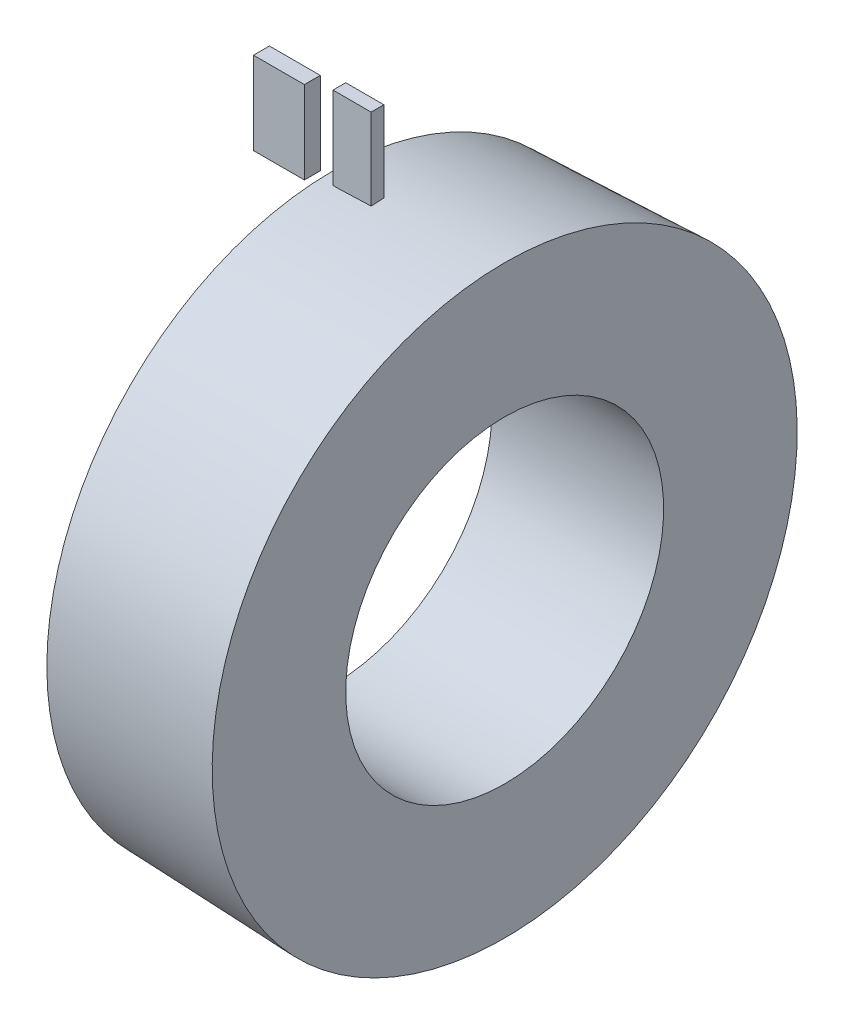
ISO-10303-21;
HEADER;
FILE_DESCRIPTION(('STEP AP214'),'2;1');
FILE_NAME('part.step','',(''),(''),'','','');
FILE_SCHEMA(('AUTOMOTIVE_DESIGN { 1 0 10303 214 1 1 1 1 }'));
ENDSEC;
DATA;
#1=APPLICATION_CONTEXT('core data for automotive mechanical design processes');
#2=APPLICATION_PROTOCOL_DEFINITION('international standard','automotive_design',2000,#1);
#3=PRODUCT_CONTEXT('',#1,'mechanical');
#4=PRODUCT('Part','Part','',(#3));
#5=PRODUCT_RELATED_PRODUCT_CATEGORY('part','',(#4));
#6=PRODUCT_DEFINITION_FORMATION('','',#4);
#7=PRODUCT_DEFINITION_CONTEXT('part definition',#1,'design');
#8=PRODUCT_DEFINITION('design','',#6,#7);
#9=PRODUCT_DEFINITION_SHAPE('','',#8);
#10=(LENGTH_UNIT() NAMED_UNIT(*) SI_UNIT(.MILLI.,.METRE.));
#11=(NAMED_UNIT(*) PLANE_ANGLE_UNIT() SI_UNIT($,.RADIAN.));
#12=(NAMED_UNIT(*) SI_UNIT($,.STERADIAN.) SOLID_ANGLE_UNIT());
#13=UNCERTAINTY_MEASURE_WITH_UNIT(LENGTH_MEASURE(1.E-05),#10,'distance_accuracy_value','');
#14=(GEOMETRIC_REPRESENTATION_CONTEXT(3) GLOBAL_UNCERTAINTY_ASSIGNED_CONTEXT((#13)) GLOBAL_UNIT_ASSIGNED_CONTEXT((#10,
#11,#12)) REPRESENTATION_CONTEXT('',''));
#15=CARTESIAN_POINT('',(0.,0.,0.));
#16=DIRECTION('',(0.,0.,1.));
#17=DIRECTION('',(1.,0.,0.));
#18=AXIS2_PLACEMENT_3D('',#15,#16,#17);
#19=CARTESIAN_POINT('',(4560.,450.,20.));
#20=DIRECTION('',(0.,1.,0.));
#21=DIRECTION('',(0.,0.,1.));
#22=AXIS2_PLACEMENT_3D('',#19,#20,#21);
#23=PLANE('',#22);
#24=DIRECTION('',(1.,0.,0.));
#25=VECTOR('',#24,1.);
#26=CARTESIAN_POINT('',(4560.,450.,0.));
#27=LINE('',#26,#25);
#28=CARTESIAN_POINT('',(4500.,450.,0.));
#29=VERTEX_POINT('',#28);
#30=CARTESIAN_POINT('',(4560.,450.,0.));
#31=VERTEX_POINT('',#30);
#32=EDGE_CURVE('E111',#29,#31,#27,.T.);
#33=ORIENTED_EDGE('',*,*,#32,.T.);
#34=DIRECTION('',(0.,0.,-1.));
#35=VECTOR('',#34,1.);
#36=CARTESIAN_POINT('',(4560.,450.,20.));
#37=LINE('',#36,#35);
#38=CARTESIAN_POINT('',(4560.,450.,20.));
#39=VERTEX_POINT('',#38);
#40=EDGE_CURVE('E12',#39,#31,#37,.T.);
#41=ORIENTED_EDGE('',*,*,#40,.F.);
#42=DIRECTION('',(1.,0.,0.));
#43=VECTOR('',#42,1.);
#44=CARTESIAN_POINT('',(4560.,450.,20.));
#45=LINE('',#44,#43);
#46=CARTESIAN_POINT('',(4500.,450.,20.));
#47=VERTEX_POINT('',#46);
#48=EDGE_CURVE('E102',#47,#39,#45,.T.);
#49=ORIENTED_EDGE('',*,*,#48,.F.);
#50=DIRECTION('',(0.,0.,-1.));
#51=VECTOR('',#50,1.);
#52=CARTESIAN_POINT('',(4500.,450.,20.));
#53=LINE('',#52,#51);
#54=EDGE_CURVE('E109',#47,#29,#53,.T.);
#55=ORIENTED_EDGE('',*,*,#54,.T.);
#56=EDGE_LOOP('',(#33,#41,#49,#55));
#57=FACE_BOUND('',#56,.T.);
#58=ADVANCED_FACE('F49',(#57),#23,.F.);
#59=CARTESIAN_POINT('',(4560.,580.,20.));
#60=DIRECTION('',(-1.,0.,0.));
#61=DIRECTION('',(0.,0.,1.));
#62=AXIS2_PLACEMENT_3D('',#59,#60,#61);
#63=PLANE('',#62);
#64=DIRECTION('',(0.,1.,0.));
#65=VECTOR('',#64,1.);
#66=CARTESIAN_POINT('',(4560.,580.,0.));
#67=LINE('',#66,#65);
#68=CARTESIAN_POINT('',(4560.,580.,0.));
#69=VERTEX_POINT('',#68);
#70=EDGE_CURVE('E103',#31,#69,#67,.T.);
#71=ORIENTED_EDGE('',*,*,#70,.T.);
#72=DIRECTION('',(0.,0.,-1.));
#73=VECTOR('',#72,1.);
#74=CARTESIAN_POINT('',(4560.,580.,20.));
#75=LINE('',#74,#73);
#76=CARTESIAN_POINT('',(4560.,580.,20.));
#77=VERTEX_POINT('',#76);
#78=EDGE_CURVE('E59',#77,#69,#75,.T.);
#79=ORIENTED_EDGE('',*,*,#78,.F.);
#80=DIRECTION('',(0.,1.,0.));
#81=VECTOR('',#80,1.);
#82=CARTESIAN_POINT('',(4560.,580.,20.));
#83=LINE('',#82,#81);
#84=EDGE_CURVE('E96',#39,#77,#83,.T.);
#85=ORIENTED_EDGE('',*,*,#84,.F.);
#86=ORIENTED_EDGE('',*,*,#40,.T.);
#87=EDGE_LOOP('',(#71,#79,#85,#86));
#88=FACE_BOUND('',#87,.T.);
#89=ADVANCED_FACE('F101',(#88),#63,.F.);
#90=CARTESIAN_POINT('',(4500.,580.,20.));
#91=DIRECTION('',(0.,-1.,0.));
#92=DIRECTION('',(0.,0.,-1.));
#93=AXIS2_PLACEMENT_3D('',#90,#91,#92);
#94=PLANE('',#93);
#95=DIRECTION('',(-1.,0.,0.));
#96=VECTOR('',#95,1.);
#97=CARTESIAN_POINT('',(4500.,580.,0.));
#98=LINE('',#97,#96);
#99=CARTESIAN_POINT('',(4500.,580.,0.));
#100=VERTEX_POINT('',#99);
#101=EDGE_CURVE('E81',#69,#100,#98,.T.);
#102=ORIENTED_EDGE('',*,*,#101,.T.);
#103=DIRECTION('',(0.,0.,-1.));
#104=VECTOR('',#103,1.);
#105=CARTESIAN_POINT('',(4500.,580.,20.));
#106=LINE('',#105,#104);
#107=CARTESIAN_POINT('',(4500.,580.,20.));
#108=VERTEX_POINT('',#107);
#109=EDGE_CURVE('E107',#108,#100,#106,.T.);
#110=ORIENTED_EDGE('',*,*,#109,.F.);
#111=DIRECTION('',(-1.,0.,0.));
#112=VECTOR('',#111,1.);
#113=CARTESIAN_POINT('',(4500.,580.,20.));
#114=LINE('',#113,#112);
#115=EDGE_CURVE('E98',#77,#108,#114,.T.);
#116=ORIENTED_EDGE('',*,*,#115,.F.);
#117=ORIENTED_EDGE('',*,*,#78,.T.);
#118=EDGE_LOOP('',(#102,#110,#116,#117));
#119=FACE_BOUND('',#118,.T.);
#120=ADVANCED_FACE('F110',(#119),#94,.F.);
#121=CARTESIAN_POINT('',(4500.,450.,20.));
#122=DIRECTION('',(1.,0.,0.));
#123=DIRECTION('',(0.,0.,-1.));
#124=AXIS2_PLACEMENT_3D('',#121,#122,#123);
#125=PLANE('',#124);
#126=DIRECTION('',(0.,-1.,0.));
#127=VECTOR('',#126,1.);
#128=CARTESIAN_POINT('',(4500.,450.,0.));
#129=LINE('',#128,#127);
#130=EDGE_CURVE('E87',#100,#29,#129,.T.);
#131=ORIENTED_EDGE('',*,*,#130,.T.);
#132=ORIENTED_EDGE('',*,*,#54,.F.);
#133=DIRECTION('',(0.,-1.,0.));
#134=VECTOR('',#133,1.);
#135=CARTESIAN_POINT('',(4500.,450.,20.));
#136=LINE('',#135,#134);
#137=EDGE_CURVE('E67',#108,#47,#136,.T.);
#138=ORIENTED_EDGE('',*,*,#137,.F.);
#139=ORIENTED_EDGE('',*,*,#109,.T.);
#140=EDGE_LOOP('',(#131,#132,#138,#139));
#141=FACE_BOUND('',#140,.T.);
#142=ADVANCED_FACE('F116',(#141),#125,.F.);
#143=CARTESIAN_POINT('',(0.,0.,20.));
#144=DIRECTION('',(0.,0.,-1.));
#145=DIRECTION('',(-1.,0.,0.));
#146=AXIS2_PLACEMENT_3D('',#143,#144,#145);
#147=PLANE('',#146);
#148=ORIENTED_EDGE('',*,*,#48,.T.);
#149=ORIENTED_EDGE('',*,*,#84,.T.);
#150=ORIENTED_EDGE('',*,*,#115,.T.);
#151=ORIENTED_EDGE('',*,*,#137,.T.);
#152=EDGE_LOOP('',(#148,#149,#150,#151));
#153=FACE_BOUND('',#152,.T.);
#154=ADVANCED_FACE('F100',(#153),#147,.F.);
#155=CARTESIAN_POINT('',(0.,0.,0.));
#156=DIRECTION('',(0.,0.,-1.));
#157=DIRECTION('',(-1.,0.,0.));
#158=AXIS2_PLACEMENT_3D('',#155,#156,#157);
#159=PLANE('',#158);
#160=ORIENTED_EDGE('',*,*,#32,.F.);
#161=ORIENTED_EDGE('',*,*,#130,.F.);
#162=ORIENTED_EDGE('',*,*,#101,.F.);
#163=ORIENTED_EDGE('',*,*,#70,.F.);
#164=EDGE_LOOP('',(#160,#161,#162,#163));
#165=FACE_BOUND('',#164,.T.);
#166=ADVANCED_FACE('F121',(#165),#159,.T.);
#167=CLOSED_SHELL('',(#58,#89,#120,#142,#154,#166));
#168=MANIFOLD_SOLID_BREP('B2',#167);
#169=CARTESIAN_POINT('',(0.,0.,0.));
#170=DIRECTION('',(-1.,0.,0.));
#171=DIRECTION('',(0.,0.,1.));
#172=AXIS2_PLACEMENT_3D('',#169,#170,#171);
#173=CYLINDRICAL_SURFACE('',#172,250.);
#174=CARTESIAN_POINT('',(4480.,0.,0.));
#175=DIRECTION('',(-1.,0.,0.));
#176=DIRECTION('',(0.,0.,1.));
#177=AXIS2_PLACEMENT_3D('',#174,#175,#176);
#178=CIRCLE('',#177,250.);
#179=CARTESIAN_POINT('',(4480.,250.,-1.79489651492081E-06));
#180=VERTEX_POINT('',#179);
#181=CARTESIAN_POINT('',(4480.,250.,0.));
#182=VERTEX_POINT('',#181);
#183=EDGE_CURVE('E48',#180,#182,#178,.T.);
#184=ORIENTED_EDGE('',*,*,#183,.T.);
#185=DIRECTION('',(1.,0.,0.));
#186=VECTOR('',#185,1.);
#187=CARTESIAN_POINT('',(4750.,250.,0.));
#188=LINE('',#187,#186);
#189=CARTESIAN_POINT('',(4750.,250.,0.));
#190=VERTEX_POINT('',#189);
#191=EDGE_CURVE('E242',#182,#190,#188,.T.);
#192=ORIENTED_EDGE('',*,*,#191,.T.);
#193=CARTESIAN_POINT('',(4750.,0.,0.));
#194=DIRECTION('',(-1.,0.,0.));
#195=DIRECTION('',(0.,0.,1.));
#196=AXIS2_PLACEMENT_3D('',#193,#194,#195);
#197=CIRCLE('',#196,250.);
#198=CARTESIAN_POINT('',(4750.,250.,-1.79489651492081E-06));
#199=VERTEX_POINT('',#198);
#200=EDGE_CURVE('E223',#199,#190,#197,.T.);
#201=ORIENTED_EDGE('',*,*,#200,.F.);
#202=DIRECTION('',(1.,0.,0.));
#203=VECTOR('',#202,1.);
#204=CARTESIAN_POINT('',(4750.,250.,-1.79489651492081E-06));
#205=LINE('',#204,#203);
#206=EDGE_CURVE('E249',#180,#199,#205,.T.);
#207=ORIENTED_EDGE('',*,*,#206,.F.);
#208=EDGE_LOOP('',(#184,#192,#201,#207));
#209=FACE_BOUND('',#208,.T.);
#210=ADVANCED_FACE('F183',(#209),#173,.F.);
#211=CARTESIAN_POINT('',(4480.,250.,-1.79489651492081E-06));
#212=DIRECTION('',(1.,0.,0.));
#213=DIRECTION('',(0.,0.,-1.));
#214=AXIS2_PLACEMENT_3D('',#211,#212,#213);
#215=PLANE('',#214);
#216=CARTESIAN_POINT('',(4480.,0.,0.));
#217=DIRECTION('',(-1.,0.,0.));
#218=DIRECTION('',(0.,0.,1.));
#219=AXIS2_PLACEMENT_3D('',#216,#217,#218);
#220=CIRCLE('',#219,450.);
#221=CARTESIAN_POINT('',(4480.,450.,-3.23081372685745E-06));
#222=VERTEX_POINT('',#221);
#223=CARTESIAN_POINT('',(4480.,450.,0.));
#224=VERTEX_POINT('',#223);
#225=EDGE_CURVE('E192',#222,#224,#220,.T.);
#226=ORIENTED_EDGE('',*,*,#225,.T.);
#227=DIRECTION('',(0.,-1.,0.));
#228=VECTOR('',#227,1.);
#229=CARTESIAN_POINT('',(4480.,250.,0.));
#230=LINE('',#229,#228);
#231=EDGE_CURVE('E250',#224,#182,#230,.T.);
#232=ORIENTED_EDGE('',*,*,#231,.T.);
#233=ORIENTED_EDGE('',*,*,#183,.F.);
#234=DIRECTION('',(0.,-1.,7.17958605968322E-09));
#235=VECTOR('',#234,1.);
#236=CARTESIAN_POINT('',(4480.,250.,-1.79489651492081E-06));
#237=LINE('',#236,#235);
#238=EDGE_CURVE('E234',#222,#180,#237,.T.);
#239=ORIENTED_EDGE('',*,*,#238,.F.);
#240=EDGE_LOOP('',(#226,#232,#233,#239));
#241=FACE_BOUND('',#240,.T.);
#242=ADVANCED_FACE('F184',(#241),#215,.F.);
#243=CARTESIAN_POINT('',(4750.,0.,0.));
#244=DIRECTION('',(1.,0.,0.));
#245=DIRECTION('',(0.,0.,-1.));
#246=AXIS2_PLACEMENT_3D('',#243,#244,#245);
#247=CONICAL_SURFACE('',#246,460.,0.0370201158739301);
#248=CARTESIAN_POINT('',(4750.,0.,0.));
#249=DIRECTION('',(-1.,0.,0.));
#250=DIRECTION('',(0.,0.,1.));
#251=AXIS2_PLACEMENT_3D('',#248,#249,#250);
#252=CIRCLE('',#251,460.);
#253=CARTESIAN_POINT('',(4750.,460.,-3.30260958745428E-06));
#254=VERTEX_POINT('',#253);
#255=CARTESIAN_POINT('',(4750.,460.,0.));
#256=VERTEX_POINT('',#255);
#257=EDGE_CURVE('E233',#254,#256,#252,.T.);
#258=ORIENTED_EDGE('',*,*,#257,.T.);
#259=DIRECTION('',(-0.999314833766767,-0.0370116605098804,0.));
#260=VECTOR('',#259,1.);
#261=CARTESIAN_POINT('',(4480.,450.,0.));
#262=LINE('',#261,#260);
#263=EDGE_CURVE('E245',#256,#224,#262,.T.);
#264=ORIENTED_EDGE('',*,*,#263,.T.);
#265=ORIENTED_EDGE('',*,*,#225,.F.);
#266=DIRECTION('',(-0.999314833766767,-0.0370116605098804,2.65728401842465E-10));
#267=VECTOR('',#266,1.);
#268=CARTESIAN_POINT('',(4480.,450.,-3.23081372685745E-06));
#269=LINE('',#268,#267);
#270=EDGE_CURVE('E255',#254,#222,#269,.T.);
#271=ORIENTED_EDGE('',*,*,#270,.F.);
#272=EDGE_LOOP('',(#258,#264,#265,#271));
#273=FACE_BOUND('',#272,.T.);
#274=ADVANCED_FACE('F251',(#273),#247,.T.);
#275=CARTESIAN_POINT('',(4750.,460.,-3.30260958745428E-06));
#276=DIRECTION('',(-1.,0.,0.));
#277=DIRECTION('',(0.,0.,1.));
#278=AXIS2_PLACEMENT_3D('',#275,#276,#277);
#279=PLANE('',#278);
#280=DIRECTION('',(0.,1.,-7.17958605968322E-09));
#281=VECTOR('',#280,1.);
#282=CARTESIAN_POINT('',(4750.,460.,-3.30260958745428E-06));
#283=LINE('',#282,#281);
#284=EDGE_CURVE('E227',#199,#254,#283,.T.);
#285=ORIENTED_EDGE('',*,*,#284,.F.);
#286=ORIENTED_EDGE('',*,*,#200,.T.);
#287=DIRECTION('',(0.,1.,0.));
#288=VECTOR('',#287,1.);
#289=CARTESIAN_POINT('',(4750.,460.,0.));
#290=LINE('',#289,#288);
#291=EDGE_CURVE('E226',#190,#256,#290,.T.);
#292=ORIENTED_EDGE('',*,*,#291,.T.);
#293=ORIENTED_EDGE('',*,*,#257,.F.);
#294=EDGE_LOOP('',(#285,#286,#292,#293));
#295=FACE_BOUND('',#294,.T.);
#296=ADVANCED_FACE('F224',(#295),#279,.F.);
#297=CARTESIAN_POINT('',(0.,0.,0.));
#298=DIRECTION('',(0.,-7.17958605968322E-09,-1.));
#299=DIRECTION('',(-1.,0.,0.));
#300=AXIS2_PLACEMENT_3D('',#297,#298,#299);
#301=PLANE('',#300);
#302=ORIENTED_EDGE('',*,*,#206,.T.);
#303=ORIENTED_EDGE('',*,*,#284,.T.);
#304=ORIENTED_EDGE('',*,*,#270,.T.);
#305=ORIENTED_EDGE('',*,*,#238,.T.);
#306=EDGE_LOOP('',(#302,#303,#304,#305));
#307=FACE_BOUND('',#306,.T.);
#308=ADVANCED_FACE('F257',(#307),#301,.F.);
#309=CARTESIAN_POINT('',(0.,0.,0.));
#310=DIRECTION('',(0.,0.,-1.));
#311=DIRECTION('',(-1.,0.,0.));
#312=AXIS2_PLACEMENT_3D('',#309,#310,#311);
#313=PLANE('',#312);
#314=ORIENTED_EDGE('',*,*,#191,.F.);
#315=ORIENTED_EDGE('',*,*,#231,.F.);
#316=ORIENTED_EDGE('',*,*,#263,.F.);
#317=ORIENTED_EDGE('',*,*,#291,.F.);
#318=EDGE_LOOP('',(#314,#315,#316,#317));
#319=FACE_BOUND('',#318,.T.);
#320=ADVANCED_FACE('F236',(#319),#313,.T.);
#321=CLOSED_SHELL('',(#210,#242,#274,#296,#308,#320));
#322=MANIFOLD_SOLID_BREP('B6',#321);
#323=CARTESIAN_POINT('',(4460.,440.,25.));
#324=DIRECTION('',(0.,1.,0.));
#325=DIRECTION('',(0.,0.,1.));
#326=AXIS2_PLACEMENT_3D('',#323,#324,#325);
#327=PLANE('',#326);
#328=DIRECTION('',(1.,0.,0.));
#329=VECTOR('',#328,1.);
#330=CARTESIAN_POINT('',(4460.,440.,0.));
#331=LINE('',#330,#329);
#332=CARTESIAN_POINT('',(4380.,440.,0.));
#333=VERTEX_POINT('',#332);
#334=CARTESIAN_POINT('',(4460.,440.,0.));
#335=VERTEX_POINT('',#334);
#336=EDGE_CURVE('E359',#333,#335,#331,.T.);
#337=ORIENTED_EDGE('',*,*,#336,.T.);
#338=DIRECTION('',(0.,0.,-1.));
#339=VECTOR('',#338,1.);
#340=CARTESIAN_POINT('',(4460.,440.,25.));
#341=LINE('',#340,#339);
#342=CARTESIAN_POINT('',(4460.,440.,25.));
#343=VERTEX_POINT('',#342);
#344=EDGE_CURVE('E181',#343,#335,#341,.T.);
#345=ORIENTED_EDGE('',*,*,#344,.F.);
#346=DIRECTION('',(1.,0.,0.));
#347=VECTOR('',#346,1.);
#348=CARTESIAN_POINT('',(4460.,440.,25.));
#349=LINE('',#348,#347);
#350=CARTESIAN_POINT('',(4380.,440.,25.));
#351=VERTEX_POINT('',#350);
#352=EDGE_CURVE('E346',#351,#343,#349,.T.);
#353=ORIENTED_EDGE('',*,*,#352,.F.);
#354=DIRECTION('',(0.,0.,-1.));
#355=VECTOR('',#354,1.);
#356=CARTESIAN_POINT('',(4380.,440.,25.));
#357=LINE('',#356,#355);
#358=EDGE_CURVE('E356',#351,#333,#357,.T.);
#359=ORIENTED_EDGE('',*,*,#358,.T.);
#360=EDGE_LOOP('',(#337,#345,#353,#359));
#361=FACE_BOUND('',#360,.T.);
#362=ADVANCED_FACE('F300',(#361),#327,.F.);
#363=CARTESIAN_POINT('',(4460.,570.,25.));
#364=DIRECTION('',(-1.,0.,0.));
#365=DIRECTION('',(0.,0.,1.));
#366=AXIS2_PLACEMENT_3D('',#363,#364,#365);
#367=PLANE('',#366);
#368=DIRECTION('',(0.,1.,0.));
#369=VECTOR('',#368,1.);
#370=CARTESIAN_POINT('',(4460.,570.,0.));
#371=LINE('',#370,#369);
#372=CARTESIAN_POINT('',(4460.,570.,0.));
#373=VERTEX_POINT('',#372);
#374=EDGE_CURVE('E355',#335,#373,#371,.T.);
#375=ORIENTED_EDGE('',*,*,#374,.T.);
#376=DIRECTION('',(0.,0.,-1.));
#377=VECTOR('',#376,1.);
#378=CARTESIAN_POINT('',(4460.,570.,25.));
#379=LINE('',#378,#377);
#380=CARTESIAN_POINT('',(4460.,570.,25.));
#381=VERTEX_POINT('',#380);
#382=EDGE_CURVE('E304',#381,#373,#379,.T.);
#383=ORIENTED_EDGE('',*,*,#382,.F.);
#384=DIRECTION('',(0.,1.,0.));
#385=VECTOR('',#384,1.);
#386=CARTESIAN_POINT('',(4460.,570.,25.));
#387=LINE('',#386,#385);
#388=EDGE_CURVE('E343',#343,#381,#387,.T.);
#389=ORIENTED_EDGE('',*,*,#388,.F.);
#390=ORIENTED_EDGE('',*,*,#344,.T.);
#391=EDGE_LOOP('',(#375,#383,#389,#390));
#392=FACE_BOUND('',#391,.T.);
#393=ADVANCED_FACE('F353',(#392),#367,.F.);
#394=CARTESIAN_POINT('',(4380.,570.,25.));
#395=DIRECTION('',(0.,-1.,0.));
#396=DIRECTION('',(0.,0.,-1.));
#397=AXIS2_PLACEMENT_3D('',#394,#395,#396);
#398=PLANE('',#397);
#399=DIRECTION('',(-1.,0.,0.));
#400=VECTOR('',#399,1.);
#401=CARTESIAN_POINT('',(4380.,570.,0.));
#402=LINE('',#401,#400);
#403=CARTESIAN_POINT('',(4380.,570.,0.));
#404=VERTEX_POINT('',#403);
#405=EDGE_CURVE('E328',#373,#404,#402,.T.);
#406=ORIENTED_EDGE('',*,*,#405,.T.);
#407=DIRECTION('',(0.,0.,-1.));
#408=VECTOR('',#407,1.);
#409=CARTESIAN_POINT('',(4380.,570.,25.));
#410=LINE('',#409,#408);
#411=CARTESIAN_POINT('',(4380.,570.,25.));
#412=VERTEX_POINT('',#411);
#413=EDGE_CURVE('E351',#412,#404,#410,.T.);
#414=ORIENTED_EDGE('',*,*,#413,.F.);
#415=DIRECTION('',(-1.,0.,0.));
#416=VECTOR('',#415,1.);
#417=CARTESIAN_POINT('',(4380.,570.,25.));
#418=LINE('',#417,#416);
#419=EDGE_CURVE('E348',#381,#412,#418,.T.);
#420=ORIENTED_EDGE('',*,*,#419,.F.);
#421=ORIENTED_EDGE('',*,*,#382,.T.);
#422=EDGE_LOOP('',(#406,#414,#420,#421));
#423=FACE_BOUND('',#422,.T.);
#424=ADVANCED_FACE('F354',(#423),#398,.F.);
#425=CARTESIAN_POINT('',(4380.,440.,25.));
#426=DIRECTION('',(1.,0.,0.));
#427=DIRECTION('',(0.,0.,-1.));
#428=AXIS2_PLACEMENT_3D('',#425,#426,#427);
#429=PLANE('',#428);
#430=DIRECTION('',(0.,-1.,0.));
#431=VECTOR('',#430,1.);
#432=CARTESIAN_POINT('',(4380.,440.,0.));
#433=LINE('',#432,#431);
#434=EDGE_CURVE('E337',#404,#333,#433,.T.);
#435=ORIENTED_EDGE('',*,*,#434,.T.);
#436=ORIENTED_EDGE('',*,*,#358,.F.);
#437=DIRECTION('',(0.,-1.,0.));
#438=VECTOR('',#437,1.);
#439=CARTESIAN_POINT('',(4380.,440.,25.));
#440=LINE('',#439,#438);
#441=EDGE_CURVE('E313',#412,#351,#440,.T.);
#442=ORIENTED_EDGE('',*,*,#441,.F.);
#443=ORIENTED_EDGE('',*,*,#413,.T.);
#444=EDGE_LOOP('',(#435,#436,#442,#443));
#445=FACE_BOUND('',#444,.T.);
#446=ADVANCED_FACE('F370',(#445),#429,.F.);
#447=CARTESIAN_POINT('',(0.,0.,25.));
#448=DIRECTION('',(0.,0.,-1.));
#449=DIRECTION('',(-1.,0.,0.));
#450=AXIS2_PLACEMENT_3D('',#447,#448,#449);
#451=PLANE('',#450);
#452=ORIENTED_EDGE('',*,*,#352,.T.);
#453=ORIENTED_EDGE('',*,*,#388,.T.);
#454=ORIENTED_EDGE('',*,*,#419,.T.);
#455=ORIENTED_EDGE('',*,*,#441,.T.);
#456=EDGE_LOOP('',(#452,#453,#454,#455));
#457=FACE_BOUND('',#456,.T.);
#458=ADVANCED_FACE('F344',(#457),#451,.F.);
#459=CARTESIAN_POINT('',(0.,0.,0.));
#460=DIRECTION('',(0.,0.,-1.));
#461=DIRECTION('',(-1.,0.,0.));
#462=AXIS2_PLACEMENT_3D('',#459,#460,#461);
#463=PLANE('',#462);
#464=ORIENTED_EDGE('',*,*,#336,.F.);
#465=ORIENTED_EDGE('',*,*,#434,.F.);
#466=ORIENTED_EDGE('',*,*,#405,.F.);
#467=ORIENTED_EDGE('',*,*,#374,.F.);
#468=EDGE_LOOP('',(#464,#465,#466,#467));
#469=FACE_BOUND('',#468,.T.);
#470=ADVANCED_FACE('F369',(#469),#463,.T.);
#471=CLOSED_SHELL('',(#362,#393,#424,#446,#458,#470));
#472=MANIFOLD_SOLID_BREP('B45',#471);
#473=ADVANCED_BREP_SHAPE_REPRESENTATION('',(#18,#168,#322,#472),#14);
#474=SHAPE_DEFINITION_REPRESENTATION(#9,#473);
ENDSEC;
END-ISO-10303-21;
